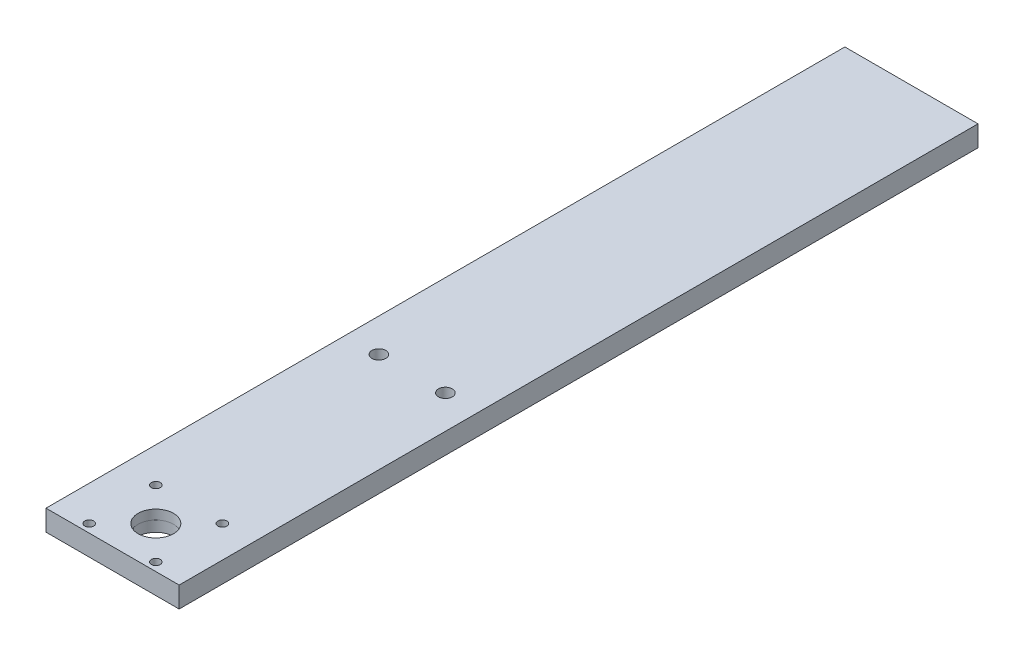
ISO-10303-21;
HEADER;
FILE_DESCRIPTION(('STEP AP214'),'2;1');
FILE_NAME('part.step','',(''),(''),'','','');
FILE_SCHEMA(('AUTOMOTIVE_DESIGN { 1 0 10303 214 1 1 1 1 }'));
ENDSEC;
DATA;
#1=APPLICATION_CONTEXT('core data for automotive mechanical design processes');
#2=APPLICATION_PROTOCOL_DEFINITION('international standard','automotive_design',2000,#1);
#3=PRODUCT_CONTEXT('',#1,'mechanical');
#4=PRODUCT('Part','Part','',(#3));
#5=PRODUCT_RELATED_PRODUCT_CATEGORY('part','',(#4));
#6=PRODUCT_DEFINITION_FORMATION('','',#4);
#7=PRODUCT_DEFINITION_CONTEXT('part definition',#1,'design');
#8=PRODUCT_DEFINITION('design','',#6,#7);
#9=PRODUCT_DEFINITION_SHAPE('','',#8);
#10=(LENGTH_UNIT() NAMED_UNIT(*) SI_UNIT(.MILLI.,.METRE.));
#11=(NAMED_UNIT(*) PLANE_ANGLE_UNIT() SI_UNIT($,.RADIAN.));
#12=(NAMED_UNIT(*) SI_UNIT($,.STERADIAN.) SOLID_ANGLE_UNIT());
#13=UNCERTAINTY_MEASURE_WITH_UNIT(LENGTH_MEASURE(1.E-05),#10,'distance_accuracy_value','');
#14=(GEOMETRIC_REPRESENTATION_CONTEXT(3) GLOBAL_UNCERTAINTY_ASSIGNED_CONTEXT((#13)) GLOBAL_UNIT_ASSIGNED_CONTEXT((#10,
#11,#12)) REPRESENTATION_CONTEXT('',''));
#15=CARTESIAN_POINT('',(0.,0.,0.));
#16=DIRECTION('',(0.,0.,1.));
#17=DIRECTION('',(1.,0.,0.));
#18=AXIS2_PLACEMENT_3D('',#15,#16,#17);
#19=CARTESIAN_POINT('',(0.625840615318438,3.96875,60.325));
#20=DIRECTION('',(0.,1.,0.));
#21=DIRECTION('',(0.,0.,1.));
#22=AXIS2_PLACEMENT_3D('',#19,#20,#21);
#23=CYLINDRICAL_SURFACE('',#22,6.75);
#24=CARTESIAN_POINT('',(0.625840615318438,3.96875,60.325));
#25=DIRECTION('',(0.,1.,0.));
#26=DIRECTION('',(0.,0.,1.));
#27=AXIS2_PLACEMENT_3D('',#24,#25,#26);
#28=CIRCLE('',#27,6.75);
#29=CARTESIAN_POINT('',(0.625840615318438,3.96875,67.075));
#30=VERTEX_POINT('',#29);
#31=EDGE_CURVE('E143',#30,#30,#28,.T.);
#32=ORIENTED_EDGE('',*,*,#31,.T.);
#33=EDGE_LOOP('',(#32));
#34=FACE_BOUND('',#33,.T.);
#35=CARTESIAN_POINT('',(0.625840615318438,0.34925,60.325));
#36=DIRECTION('',(0.,-1.,0.));
#37=DIRECTION('',(0.,0.,-1.));
#38=AXIS2_PLACEMENT_3D('',#35,#36,#37);
#39=CIRCLE('',#38,6.75);
#40=CARTESIAN_POINT('',(0.625840615318438,0.34925,53.575));
#41=VERTEX_POINT('',#40);
#42=EDGE_CURVE('E46',#41,#41,#39,.F.);
#43=ORIENTED_EDGE('',*,*,#42,.F.);
#44=EDGE_LOOP('',(#43));
#45=FACE_BOUND('',#44,.T.);
#46=ADVANCED_FACE('F42',(#34,#45),#23,.F.);
#47=CARTESIAN_POINT('',(25.4,-3.96875,76.2));
#48=DIRECTION('',(0.,1.,0.));
#49=DIRECTION('',(0.,0.,1.));
#50=AXIS2_PLACEMENT_3D('',#47,#48,#49);
#51=PLANE('',#50);
#52=CARTESIAN_POINT('',(13.3258406153184,-3.96875,47.625));
#53=DIRECTION('',(0.,-1.,0.));
#54=DIRECTION('',(0.,0.,-1.));
#55=AXIS2_PLACEMENT_3D('',#52,#53,#54);
#56=CIRCLE('',#55,1.7);
#57=CARTESIAN_POINT('',(13.3258406153184,-3.96875,45.925));
#58=VERTEX_POINT('',#57);
#59=EDGE_CURVE('E314',#58,#58,#56,.T.);
#60=ORIENTED_EDGE('',*,*,#59,.F.);
#61=EDGE_LOOP('',(#60));
#62=FACE_BOUND('',#61,.T.);
#63=CARTESIAN_POINT('',(13.3258406153184,-3.96875,73.025));
#64=DIRECTION('',(0.,-1.,0.));
#65=DIRECTION('',(0.,0.,-1.));
#66=AXIS2_PLACEMENT_3D('',#63,#64,#65);
#67=CIRCLE('',#66,1.7);
#68=CARTESIAN_POINT('',(13.3258406153184,-3.96875,71.325));
#69=VERTEX_POINT('',#68);
#70=EDGE_CURVE('E306',#69,#69,#67,.T.);
#71=ORIENTED_EDGE('',*,*,#70,.F.);
#72=EDGE_LOOP('',(#71));
#73=FACE_BOUND('',#72,.T.);
#74=CARTESIAN_POINT('',(-12.0741593846816,-3.96875,73.025));
#75=DIRECTION('',(0.,-1.,0.));
#76=DIRECTION('',(0.,0.,-1.));
#77=AXIS2_PLACEMENT_3D('',#74,#75,#76);
#78=CIRCLE('',#77,1.7);
#79=CARTESIAN_POINT('',(-12.0741593846816,-3.96875,71.325));
#80=VERTEX_POINT('',#79);
#81=EDGE_CURVE('E298',#80,#80,#78,.T.);
#82=ORIENTED_EDGE('',*,*,#81,.F.);
#83=EDGE_LOOP('',(#82));
#84=FACE_BOUND('',#83,.T.);
#85=CARTESIAN_POINT('',(-12.0741593846816,-3.96875,47.625));
#86=DIRECTION('',(0.,-1.,0.));
#87=DIRECTION('',(0.,0.,-1.));
#88=AXIS2_PLACEMENT_3D('',#85,#86,#87);
#89=CIRCLE('',#88,1.7);
#90=CARTESIAN_POINT('',(-12.0741593846816,-3.96875,45.925));
#91=VERTEX_POINT('',#90);
#92=EDGE_CURVE('E286',#91,#91,#89,.T.);
#93=ORIENTED_EDGE('',*,*,#92,.F.);
#94=EDGE_LOOP('',(#93));
#95=FACE_BOUND('',#94,.T.);
#96=CARTESIAN_POINT('',(0.625840615318438,-3.96875,60.325));
#97=DIRECTION('',(0.,-1.,0.));
#98=DIRECTION('',(0.,0.,-1.));
#99=AXIS2_PLACEMENT_3D('',#96,#97,#98);
#100=CIRCLE('',#99,7.112);
#101=CARTESIAN_POINT('',(0.625840615318438,-3.96875,53.213));
#102=VERTEX_POINT('',#101);
#103=EDGE_CURVE('E112',#102,#102,#100,.T.);
#104=ORIENTED_EDGE('',*,*,#103,.F.);
#105=EDGE_LOOP('',(#104));
#106=FACE_BOUND('',#105,.T.);
#107=CARTESIAN_POINT('',(-12.7,-3.96875,-38.1));
#108=DIRECTION('',(0.,-1.,0.));
#109=DIRECTION('',(0.,0.,-1.));
#110=AXIS2_PLACEMENT_3D('',#107,#108,#109);
#111=CIRCLE('',#110,5.2);
#112=CARTESIAN_POINT('',(-12.7,-3.96875,-43.3));
#113=VERTEX_POINT('',#112);
#114=EDGE_CURVE('E131',#113,#113,#111,.T.);
#115=ORIENTED_EDGE('',*,*,#114,.F.);
#116=EDGE_LOOP('',(#115));
#117=FACE_BOUND('',#116,.T.);
#118=DIRECTION('',(0.,0.,-1.));
#119=VECTOR('',#118,1.);
#120=CARTESIAN_POINT('',(-25.4,-3.96875,76.2));
#121=LINE('',#120,#119);
#122=CARTESIAN_POINT('',(-25.4,-3.96875,76.2));
#123=VERTEX_POINT('',#122);
#124=CARTESIAN_POINT('',(-25.4,-3.96874999999999,-228.6));
#125=VERTEX_POINT('',#124);
#126=EDGE_CURVE('E11',#123,#125,#121,.T.);
#127=ORIENTED_EDGE('',*,*,#126,.T.);
#128=DIRECTION('',(1.,0.,0.));
#129=VECTOR('',#128,1.);
#130=CARTESIAN_POINT('',(25.4,-3.96874999999999,-228.6));
#131=LINE('',#130,#129);
#132=CARTESIAN_POINT('',(25.4,-3.96874999999999,-228.6));
#133=VERTEX_POINT('',#132);
#134=EDGE_CURVE('E115',#125,#133,#131,.T.);
#135=ORIENTED_EDGE('',*,*,#134,.T.);
#136=DIRECTION('',(0.,0.,-1.));
#137=VECTOR('',#136,1.);
#138=CARTESIAN_POINT('',(25.4,-3.96875,76.2));
#139=LINE('',#138,#137);
#140=CARTESIAN_POINT('',(25.4,-3.96875,76.2));
#141=VERTEX_POINT('',#140);
#142=EDGE_CURVE('E52',#141,#133,#139,.T.);
#143=ORIENTED_EDGE('',*,*,#142,.F.);
#144=DIRECTION('',(1.,0.,0.));
#145=VECTOR('',#144,1.);
#146=CARTESIAN_POINT('',(25.4,-3.96875,76.2));
#147=LINE('',#146,#145);
#148=EDGE_CURVE('E150',#123,#141,#147,.T.);
#149=ORIENTED_EDGE('',*,*,#148,.F.);
#150=EDGE_LOOP('',(#127,#135,#143,#149));
#151=FACE_BOUND('',#150,.T.);
#152=CARTESIAN_POINT('',(12.7,-3.96875,-38.1));
#153=DIRECTION('',(0.,-1.,0.));
#154=DIRECTION('',(0.,0.,-1.));
#155=AXIS2_PLACEMENT_3D('',#152,#153,#154);
#156=CIRCLE('',#155,5.2);
#157=CARTESIAN_POINT('',(12.7,-3.96875,-43.3));
#158=VERTEX_POINT('',#157);
#159=EDGE_CURVE('E119',#158,#158,#156,.T.);
#160=ORIENTED_EDGE('',*,*,#159,.F.);
#161=EDGE_LOOP('',(#160));
#162=FACE_BOUND('',#161,.T.);
#163=ADVANCED_FACE('F165',(#62,#73,#84,#95,#106,#117,#151,#162),#51,.F.);
#164=CARTESIAN_POINT('',(-25.4,3.96875,76.2));
#165=DIRECTION('',(1.,0.,0.));
#166=DIRECTION('',(0.,0.,-1.));
#167=AXIS2_PLACEMENT_3D('',#164,#165,#166);
#168=PLANE('',#167);
#169=DIRECTION('',(0.,0.,-1.));
#170=VECTOR('',#169,1.);
#171=CARTESIAN_POINT('',(-25.4,3.96875,76.2));
#172=LINE('',#171,#170);
#173=CARTESIAN_POINT('',(-25.4,3.96875,76.2));
#174=VERTEX_POINT('',#173);
#175=CARTESIAN_POINT('',(-25.4,3.96875,-228.6));
#176=VERTEX_POINT('',#175);
#177=EDGE_CURVE('E90',#174,#176,#172,.T.);
#178=ORIENTED_EDGE('',*,*,#177,.T.);
#179=DIRECTION('',(0.,1.,0.));
#180=VECTOR('',#179,1.);
#181=CARTESIAN_POINT('',(-25.4,-164.612455136554,-228.6));
#182=LINE('',#181,#180);
#183=EDGE_CURVE('E100',#125,#176,#182,.T.);
#184=ORIENTED_EDGE('',*,*,#183,.F.);
#185=ORIENTED_EDGE('',*,*,#126,.F.);
#186=DIRECTION('',(0.,-1.,0.));
#187=VECTOR('',#186,1.);
#188=CARTESIAN_POINT('',(-25.4,3.96875,76.2));
#189=LINE('',#188,#187);
#190=EDGE_CURVE('E147',#174,#123,#189,.T.);
#191=ORIENTED_EDGE('',*,*,#190,.F.);
#192=EDGE_LOOP('',(#178,#184,#185,#191));
#193=FACE_BOUND('',#192,.T.);
#194=ADVANCED_FACE('F44',(#193),#168,.F.);
#195=CARTESIAN_POINT('',(25.4,3.96875,76.2));
#196=DIRECTION('',(-1.,0.,0.));
#197=DIRECTION('',(0.,0.,1.));
#198=AXIS2_PLACEMENT_3D('',#195,#196,#197);
#199=PLANE('',#198);
#200=ORIENTED_EDGE('',*,*,#142,.T.);
#201=DIRECTION('',(0.,1.,0.));
#202=VECTOR('',#201,1.);
#203=CARTESIAN_POINT('',(25.4,-164.612455136554,-228.6));
#204=LINE('',#203,#202);
#205=CARTESIAN_POINT('',(25.4,3.96875,-228.6));
#206=VERTEX_POINT('',#205);
#207=EDGE_CURVE('E93',#133,#206,#204,.T.);
#208=ORIENTED_EDGE('',*,*,#207,.T.);
#209=DIRECTION('',(0.,0.,-1.));
#210=VECTOR('',#209,1.);
#211=CARTESIAN_POINT('',(25.4,3.96875,76.2));
#212=LINE('',#211,#210);
#213=CARTESIAN_POINT('',(25.4,3.96875,76.2));
#214=VERTEX_POINT('',#213);
#215=EDGE_CURVE('E83',#214,#206,#212,.T.);
#216=ORIENTED_EDGE('',*,*,#215,.F.);
#217=DIRECTION('',(0.,1.,0.));
#218=VECTOR('',#217,1.);
#219=CARTESIAN_POINT('',(25.4,3.96875,76.2));
#220=LINE('',#219,#218);
#221=EDGE_CURVE('E64',#141,#214,#220,.T.);
#222=ORIENTED_EDGE('',*,*,#221,.F.);
#223=EDGE_LOOP('',(#200,#208,#216,#222));
#224=FACE_BOUND('',#223,.T.);
#225=ADVANCED_FACE('F94',(#224),#199,.F.);
#226=CARTESIAN_POINT('',(25.4,3.96875,76.2));
#227=DIRECTION('',(0.,-1.,0.));
#228=DIRECTION('',(0.,0.,-1.));
#229=AXIS2_PLACEMENT_3D('',#226,#227,#228);
#230=PLANE('',#229);
#231=CARTESIAN_POINT('',(13.3258406153184,3.96875,47.625));
#232=DIRECTION('',(0.,-1.,0.));
#233=DIRECTION('',(0.,0.,-1.));
#234=AXIS2_PLACEMENT_3D('',#231,#232,#233);
#235=CIRCLE('',#234,1.7);
#236=CARTESIAN_POINT('',(13.3258406153184,3.96875,45.925));
#237=VERTEX_POINT('',#236);
#238=EDGE_CURVE('E310',#237,#237,#235,.T.);
#239=ORIENTED_EDGE('',*,*,#238,.T.);
#240=EDGE_LOOP('',(#239));
#241=FACE_BOUND('',#240,.T.);
#242=CARTESIAN_POINT('',(13.3258406153184,3.96875,73.025));
#243=DIRECTION('',(0.,-1.,0.));
#244=DIRECTION('',(0.,0.,-1.));
#245=AXIS2_PLACEMENT_3D('',#242,#243,#244);
#246=CIRCLE('',#245,1.7);
#247=CARTESIAN_POINT('',(13.3258406153184,3.96875,71.325));
#248=VERTEX_POINT('',#247);
#249=EDGE_CURVE('E302',#248,#248,#246,.T.);
#250=ORIENTED_EDGE('',*,*,#249,.T.);
#251=EDGE_LOOP('',(#250));
#252=FACE_BOUND('',#251,.T.);
#253=CARTESIAN_POINT('',(-12.0741593846816,3.96875,73.025));
#254=DIRECTION('',(0.,-1.,0.));
#255=DIRECTION('',(0.,0.,-1.));
#256=AXIS2_PLACEMENT_3D('',#253,#254,#255);
#257=CIRCLE('',#256,1.7);
#258=CARTESIAN_POINT('',(-12.0741593846816,3.96875,71.325));
#259=VERTEX_POINT('',#258);
#260=EDGE_CURVE('E292',#259,#259,#257,.T.);
#261=ORIENTED_EDGE('',*,*,#260,.T.);
#262=EDGE_LOOP('',(#261));
#263=FACE_BOUND('',#262,.T.);
#264=CARTESIAN_POINT('',(-12.0741593846816,3.96875,47.625));
#265=DIRECTION('',(0.,-1.,0.));
#266=DIRECTION('',(0.,0.,-1.));
#267=AXIS2_PLACEMENT_3D('',#264,#265,#266);
#268=CIRCLE('',#267,1.7);
#269=CARTESIAN_POINT('',(-12.0741593846816,3.96875,45.925));
#270=VERTEX_POINT('',#269);
#271=EDGE_CURVE('E282',#270,#270,#268,.T.);
#272=ORIENTED_EDGE('',*,*,#271,.T.);
#273=EDGE_LOOP('',(#272));
#274=FACE_BOUND('',#273,.T.);
#275=CARTESIAN_POINT('',(12.7,3.96875,-38.1));
#276=DIRECTION('',(0.,-1.,0.));
#277=DIRECTION('',(0.,0.,-1.));
#278=AXIS2_PLACEMENT_3D('',#275,#276,#277);
#279=CIRCLE('',#278,2.65);
#280=CARTESIAN_POINT('',(12.7,3.96875,-40.75));
#281=VERTEX_POINT('',#280);
#282=EDGE_CURVE('E127',#281,#281,#279,.T.);
#283=ORIENTED_EDGE('',*,*,#282,.T.);
#284=EDGE_LOOP('',(#283));
#285=FACE_BOUND('',#284,.T.);
#286=CARTESIAN_POINT('',(-12.7,3.96875,-38.1));
#287=DIRECTION('',(0.,-1.,0.));
#288=DIRECTION('',(0.,0.,-1.));
#289=AXIS2_PLACEMENT_3D('',#286,#287,#288);
#290=CIRCLE('',#289,2.65);
#291=CARTESIAN_POINT('',(-12.7,3.96875,-40.75));
#292=VERTEX_POINT('',#291);
#293=EDGE_CURVE('E139',#292,#292,#290,.T.);
#294=ORIENTED_EDGE('',*,*,#293,.T.);
#295=EDGE_LOOP('',(#294));
#296=FACE_BOUND('',#295,.T.);
#297=ORIENTED_EDGE('',*,*,#31,.F.);
#298=EDGE_LOOP('',(#297));
#299=FACE_BOUND('',#298,.T.);
#300=ORIENTED_EDGE('',*,*,#215,.T.);
#301=DIRECTION('',(-1.,0.,0.));
#302=VECTOR('',#301,1.);
#303=CARTESIAN_POINT('',(25.4,3.96875,-228.6));
#304=LINE('',#303,#302);
#305=EDGE_CURVE('E87',#206,#176,#304,.T.);
#306=ORIENTED_EDGE('',*,*,#305,.T.);
#307=ORIENTED_EDGE('',*,*,#177,.F.);
#308=DIRECTION('',(-1.,0.,0.));
#309=VECTOR('',#308,1.);
#310=CARTESIAN_POINT('',(25.4,3.96875,76.2));
#311=LINE('',#310,#309);
#312=EDGE_CURVE('E59',#214,#174,#311,.T.);
#313=ORIENTED_EDGE('',*,*,#312,.F.);
#314=EDGE_LOOP('',(#300,#306,#307,#313));
#315=FACE_BOUND('',#314,.T.);
#316=ADVANCED_FACE('F85',(#241,#252,#263,#274,#285,#296,#299,#315),#230,.F.);
#317=CARTESIAN_POINT('',(0.,0.,76.2));
#318=DIRECTION('',(0.,0.,-1.));
#319=DIRECTION('',(-1.,0.,0.));
#320=AXIS2_PLACEMENT_3D('',#317,#318,#319);
#321=PLANE('',#320);
#322=ORIENTED_EDGE('',*,*,#190,.T.);
#323=ORIENTED_EDGE('',*,*,#148,.T.);
#324=ORIENTED_EDGE('',*,*,#221,.T.);
#325=ORIENTED_EDGE('',*,*,#312,.T.);
#326=EDGE_LOOP('',(#322,#323,#324,#325));
#327=FACE_BOUND('',#326,.T.);
#328=ADVANCED_FACE('F163',(#327),#321,.F.);
#329=CARTESIAN_POINT('',(-12.7,-3.96875,-38.1));
#330=DIRECTION('',(0.,-1.,0.));
#331=DIRECTION('',(0.,0.,-1.));
#332=AXIS2_PLACEMENT_3D('',#329,#330,#331);
#333=CYLINDRICAL_SURFACE('',#332,2.65);
#334=ORIENTED_EDGE('',*,*,#293,.F.);
#335=EDGE_LOOP('',(#334));
#336=FACE_BOUND('',#335,.T.);
#337=CARTESIAN_POINT('',(-12.7,-1.41875,-38.1));
#338=DIRECTION('',(0.,-1.,0.));
#339=DIRECTION('',(0.,0.,-1.));
#340=AXIS2_PLACEMENT_3D('',#337,#338,#339);
#341=CIRCLE('',#340,2.65);
#342=CARTESIAN_POINT('',(-12.7,-1.41875,-40.75));
#343=VERTEX_POINT('',#342);
#344=EDGE_CURVE('E135',#343,#343,#341,.T.);
#345=ORIENTED_EDGE('',*,*,#344,.T.);
#346=EDGE_LOOP('',(#345));
#347=FACE_BOUND('',#346,.T.);
#348=ADVANCED_FACE('F195',(#336,#347),#333,.F.);
#349=CARTESIAN_POINT('',(-12.7,-3.96875,-38.1));
#350=DIRECTION('',(0.,-1.,0.));
#351=DIRECTION('',(0.,0.,-1.));
#352=AXIS2_PLACEMENT_3D('',#349,#350,#351);
#353=CONICAL_SURFACE('',#352,5.2,0.785398163397449);
#354=ORIENTED_EDGE('',*,*,#344,.F.);
#355=EDGE_LOOP('',(#354));
#356=FACE_BOUND('',#355,.T.);
#357=ORIENTED_EDGE('',*,*,#114,.T.);
#358=EDGE_LOOP('',(#357));
#359=FACE_BOUND('',#358,.T.);
#360=ADVANCED_FACE('F182',(#356,#359),#353,.F.);
#361=CARTESIAN_POINT('',(12.7,-3.96875,-38.1));
#362=DIRECTION('',(0.,-1.,0.));
#363=DIRECTION('',(0.,0.,-1.));
#364=AXIS2_PLACEMENT_3D('',#361,#362,#363);
#365=CYLINDRICAL_SURFACE('',#364,2.65);
#366=ORIENTED_EDGE('',*,*,#282,.F.);
#367=EDGE_LOOP('',(#366));
#368=FACE_BOUND('',#367,.T.);
#369=CARTESIAN_POINT('',(12.7,-1.41875,-38.1));
#370=DIRECTION('',(0.,-1.,0.));
#371=DIRECTION('',(0.,0.,-1.));
#372=AXIS2_PLACEMENT_3D('',#369,#370,#371);
#373=CIRCLE('',#372,2.65);
#374=CARTESIAN_POINT('',(12.7,-1.41875,-40.75));
#375=VERTEX_POINT('',#374);
#376=EDGE_CURVE('E123',#375,#375,#373,.T.);
#377=ORIENTED_EDGE('',*,*,#376,.T.);
#378=EDGE_LOOP('',(#377));
#379=FACE_BOUND('',#378,.T.);
#380=ADVANCED_FACE('F173',(#368,#379),#365,.F.);
#381=CARTESIAN_POINT('',(12.7,-3.96875,-38.1));
#382=DIRECTION('',(0.,-1.,0.));
#383=DIRECTION('',(0.,0.,-1.));
#384=AXIS2_PLACEMENT_3D('',#381,#382,#383);
#385=CONICAL_SURFACE('',#384,5.2,0.785398163397448);
#386=ORIENTED_EDGE('',*,*,#376,.F.);
#387=EDGE_LOOP('',(#386));
#388=FACE_BOUND('',#387,.T.);
#389=ORIENTED_EDGE('',*,*,#159,.T.);
#390=EDGE_LOOP('',(#389));
#391=FACE_BOUND('',#390,.T.);
#392=ADVANCED_FACE('F171',(#388,#391),#385,.F.);
#393=CARTESIAN_POINT('',(25.4,-164.612455136554,-228.6));
#394=DIRECTION('',(0.,0.,-1.));
#395=DIRECTION('',(-1.,0.,0.));
#396=AXIS2_PLACEMENT_3D('',#393,#394,#395);
#397=PLANE('',#396);
#398=ORIENTED_EDGE('',*,*,#134,.F.);
#399=ORIENTED_EDGE('',*,*,#183,.T.);
#400=ORIENTED_EDGE('',*,*,#305,.F.);
#401=ORIENTED_EDGE('',*,*,#207,.F.);
#402=EDGE_LOOP('',(#398,#399,#400,#401));
#403=FACE_BOUND('',#402,.T.);
#404=ADVANCED_FACE('F103',(#403),#397,.T.);
#405=CARTESIAN_POINT('',(0.625840615318438,0.34925,60.325));
#406=DIRECTION('',(0.,-1.,0.));
#407=DIRECTION('',(0.,0.,-1.));
#408=AXIS2_PLACEMENT_3D('',#405,#406,#407);
#409=PLANE('',#408);
#410=CARTESIAN_POINT('',(0.625840615318438,0.34925,60.325));
#411=DIRECTION('',(0.,-1.,0.));
#412=DIRECTION('',(0.,0.,-1.));
#413=AXIS2_PLACEMENT_3D('',#410,#411,#412);
#414=CIRCLE('',#413,7.112);
#415=CARTESIAN_POINT('',(0.625840615318438,0.34925,53.213));
#416=VERTEX_POINT('',#415);
#417=EDGE_CURVE('E109',#416,#416,#414,.T.);
#418=ORIENTED_EDGE('',*,*,#417,.T.);
#419=EDGE_LOOP('',(#418));
#420=FACE_BOUND('',#419,.T.);
#421=ORIENTED_EDGE('',*,*,#42,.T.);
#422=EDGE_LOOP('',(#421));
#423=FACE_BOUND('',#422,.T.);
#424=ADVANCED_FACE('F180',(#420,#423),#409,.T.);
#425=CARTESIAN_POINT('',(0.625840615318438,0.34925,60.325));
#426=DIRECTION('',(0.,-1.,0.));
#427=DIRECTION('',(0.,0.,-1.));
#428=AXIS2_PLACEMENT_3D('',#425,#426,#427);
#429=CYLINDRICAL_SURFACE('',#428,7.112);
#430=ORIENTED_EDGE('',*,*,#417,.F.);
#431=EDGE_LOOP('',(#430));
#432=FACE_BOUND('',#431,.T.);
#433=ORIENTED_EDGE('',*,*,#103,.T.);
#434=EDGE_LOOP('',(#433));
#435=FACE_BOUND('',#434,.T.);
#436=ADVANCED_FACE('F219',(#432,#435),#429,.F.);
#437=CARTESIAN_POINT('',(-12.0741593846816,-3.96875,47.625));
#438=DIRECTION('',(0.,-1.,0.));
#439=DIRECTION('',(0.,0.,-1.));
#440=AXIS2_PLACEMENT_3D('',#437,#438,#439);
#441=CYLINDRICAL_SURFACE('',#440,1.7);
#442=ORIENTED_EDGE('',*,*,#92,.T.);
#443=EDGE_LOOP('',(#442));
#444=FACE_BOUND('',#443,.T.);
#445=ORIENTED_EDGE('',*,*,#271,.F.);
#446=EDGE_LOOP('',(#445));
#447=FACE_BOUND('',#446,.T.);
#448=ADVANCED_FACE('F228',(#444,#447),#441,.F.);
#449=CARTESIAN_POINT('',(-12.0741593846816,-3.96875,73.025));
#450=DIRECTION('',(0.,-1.,0.));
#451=DIRECTION('',(0.,0.,-1.));
#452=AXIS2_PLACEMENT_3D('',#449,#450,#451);
#453=CYLINDRICAL_SURFACE('',#452,1.7);
#454=ORIENTED_EDGE('',*,*,#81,.T.);
#455=EDGE_LOOP('',(#454));
#456=FACE_BOUND('',#455,.T.);
#457=ORIENTED_EDGE('',*,*,#260,.F.);
#458=EDGE_LOOP('',(#457));
#459=FACE_BOUND('',#458,.T.);
#460=ADVANCED_FACE('F233',(#456,#459),#453,.F.);
#461=CARTESIAN_POINT('',(13.3258406153184,-3.96875,73.025));
#462=DIRECTION('',(0.,-1.,0.));
#463=DIRECTION('',(0.,0.,-1.));
#464=AXIS2_PLACEMENT_3D('',#461,#462,#463);
#465=CYLINDRICAL_SURFACE('',#464,1.7);
#466=ORIENTED_EDGE('',*,*,#70,.T.);
#467=EDGE_LOOP('',(#466));
#468=FACE_BOUND('',#467,.T.);
#469=ORIENTED_EDGE('',*,*,#249,.F.);
#470=EDGE_LOOP('',(#469));
#471=FACE_BOUND('',#470,.T.);
#472=ADVANCED_FACE('F243',(#468,#471),#465,.F.);
#473=CARTESIAN_POINT('',(13.3258406153184,-3.96875,47.625));
#474=DIRECTION('',(0.,-1.,0.));
#475=DIRECTION('',(0.,0.,-1.));
#476=AXIS2_PLACEMENT_3D('',#473,#474,#475);
#477=CYLINDRICAL_SURFACE('',#476,1.7);
#478=ORIENTED_EDGE('',*,*,#59,.T.);
#479=EDGE_LOOP('',(#478));
#480=FACE_BOUND('',#479,.T.);
#481=ORIENTED_EDGE('',*,*,#238,.F.);
#482=EDGE_LOOP('',(#481));
#483=FACE_BOUND('',#482,.T.);
#484=ADVANCED_FACE('F253',(#480,#483),#477,.F.);
#485=CLOSED_SHELL('',(#46,#163,#194,#225,#316,#328,#348,#360,#380,#392,#404,#424,#436,#448,#460,
#472,#484));
#486=MANIFOLD_SOLID_BREP('B2',#485);
#487=ADVANCED_BREP_SHAPE_REPRESENTATION('',(#18,#486),#14);
#488=SHAPE_DEFINITION_REPRESENTATION(#9,#487);
ENDSEC;
END-ISO-10303-21;
